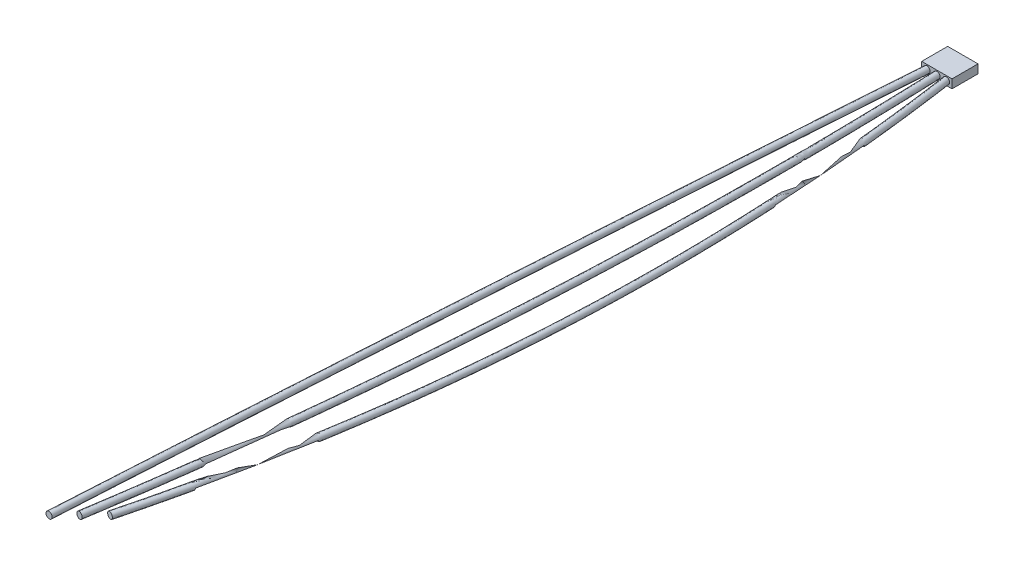
ISO-10303-21;
HEADER;
FILE_DESCRIPTION(('STEP AP214'),'2;1');
FILE_NAME('part.step','',(''),(''),'','','');
FILE_SCHEMA(('AUTOMOTIVE_DESIGN { 1 0 10303 214 1 1 1 1 }'));
ENDSEC;
DATA;
#1=APPLICATION_CONTEXT('core data for automotive mechanical design processes');
#2=APPLICATION_PROTOCOL_DEFINITION('international standard','automotive_design',2000,#1);
#3=PRODUCT_CONTEXT('',#1,'mechanical');
#4=PRODUCT('Part','Part','',(#3));
#5=PRODUCT_RELATED_PRODUCT_CATEGORY('part','',(#4));
#6=PRODUCT_DEFINITION_FORMATION('','',#4);
#7=PRODUCT_DEFINITION_CONTEXT('part definition',#1,'design');
#8=PRODUCT_DEFINITION('design','',#6,#7);
#9=PRODUCT_DEFINITION_SHAPE('','',#8);
#10=(LENGTH_UNIT() NAMED_UNIT(*) SI_UNIT(.MILLI.,.METRE.));
#11=(NAMED_UNIT(*) PLANE_ANGLE_UNIT() SI_UNIT($,.RADIAN.));
#12=(NAMED_UNIT(*) SI_UNIT($,.STERADIAN.) SOLID_ANGLE_UNIT());
#13=UNCERTAINTY_MEASURE_WITH_UNIT(LENGTH_MEASURE(1.E-05),#10,'distance_accuracy_value','');
#14=(GEOMETRIC_REPRESENTATION_CONTEXT(3) GLOBAL_UNCERTAINTY_ASSIGNED_CONTEXT((#13)) GLOBAL_UNIT_ASSIGNED_CONTEXT((#10,
#11,#12)) REPRESENTATION_CONTEXT('',''));
#15=CARTESIAN_POINT('',(0.,0.,0.));
#16=DIRECTION('',(0.,0.,1.));
#17=DIRECTION('',(1.,0.,0.));
#18=AXIS2_PLACEMENT_3D('',#15,#16,#17);
#19=CARTESIAN_POINT('',(0.,0.,6.));
#20=DIRECTION('',(0.,0.,1.));
#21=DIRECTION('',(1.,0.,0.));
#22=AXIS2_PLACEMENT_3D('',#19,#20,#21);
#23=PLANE('',#22);
#24=DIRECTION('',(0.,-1.,0.));
#25=VECTOR('',#24,1.);
#26=CARTESIAN_POINT('',(-3.49999990389549,-0.75,6.));
#27=LINE('',#26,#25);
#28=CARTESIAN_POINT('',(-3.49999990389549,-0.75,6.));
#29=VERTEX_POINT('',#28);
#30=CARTESIAN_POINT('',(-3.49999990389549,-2.75,6.));
#31=VERTEX_POINT('',#30);
#32=EDGE_CURVE('E136',#29,#31,#27,.T.);
#33=ORIENTED_EDGE('',*,*,#32,.T.);
#34=DIRECTION('',(1.,0.,0.));
#35=VECTOR('',#34,1.);
#36=CARTESIAN_POINT('',(-3.49999990389549,-2.75,6.));
#37=LINE('',#36,#35);
#38=CARTESIAN_POINT('',(3.50000009610451,-2.75,6.));
#39=VERTEX_POINT('',#38);
#40=EDGE_CURVE('E139',#31,#39,#37,.T.);
#41=ORIENTED_EDGE('',*,*,#40,.T.);
#42=DIRECTION('',(0.,1.,0.));
#43=VECTOR('',#42,1.);
#44=CARTESIAN_POINT('',(3.50000009610451,-0.75,6.));
#45=LINE('',#44,#43);
#46=CARTESIAN_POINT('',(3.50000009610451,-0.75,6.));
#47=VERTEX_POINT('',#46);
#48=EDGE_CURVE('E142',#39,#47,#45,.T.);
#49=ORIENTED_EDGE('',*,*,#48,.T.);
#50=DIRECTION('',(-1.,0.,0.));
#51=VECTOR('',#50,1.);
#52=CARTESIAN_POINT('',(-3.49999990389549,-0.75,6.));
#53=LINE('',#52,#51);
#54=EDGE_CURVE('E144',#47,#29,#53,.T.);
#55=ORIENTED_EDGE('',*,*,#54,.T.);
#56=EDGE_LOOP('',(#33,#41,#49,#55));
#57=FACE_BOUND('',#56,.T.);
#58=CARTESIAN_POINT('',(0.,-2.5,6.));
#59=CARTESIAN_POINT('',(0.0422420601804986,-2.50003573231938,6.));
#60=CARTESIAN_POINT('',(0.0844735845902979,-2.49643819312175,6.));
#61=CARTESIAN_POINT('',(0.167713085295432,-2.48223968151856,6.));
#62=CARTESIAN_POINT('',(0.208721911314351,-2.47164369717844,6.));
#63=CARTESIAN_POINT('',(0.288395779722045,-2.44370414170498,6.));
#64=CARTESIAN_POINT('',(0.327059709431002,-2.42635739576961,6.));
#65=CARTESIAN_POINT('',(0.400918183425985,-2.38542290999455,6.));
#66=CARTESIAN_POINT('',(0.436113425811239,-2.361836429483,6.00000000000001));
#67=CARTESIAN_POINT('',(0.502035117057498,-2.30909136822062,6.00000000000001));
#68=CARTESIAN_POINT('',(0.532762471171453,-2.27993391899949,6.));
#69=CARTESIAN_POINT('',(0.588882107704938,-2.21687142325243,6.));
#70=CARTESIAN_POINT('',(0.614274409453697,-2.18296639392802,6.));
#71=CARTESIAN_POINT('',(0.658986404039286,-2.11139308858211,6.));
#72=CARTESIAN_POINT('',(0.678309794516569,-2.07372712251885,6.));
#73=CARTESIAN_POINT('',(0.710353107609216,-1.99568675330466,6.));
#74=CARTESIAN_POINT('',(0.723073476653442,-1.95531253346665,6.));
#75=CARTESIAN_POINT('',(0.741544363254771,-1.87302476356265,6.));
#76=CARTESIAN_POINT('',(0.747298927163904,-1.83111212174134,6.));
#77=CARTESIAN_POINT('',(0.751687651378401,-1.74691476017158,6.));
#78=CARTESIAN_POINT('',(0.750321664135935,-1.70463003273112,6.));
#79=CARTESIAN_POINT('',(0.740509421584652,-1.62090347538399,6.));
#80=CARTESIAN_POINT('',(0.732065341839116,-1.57946139048631,6.));
#81=CARTESIAN_POINT('',(0.708340428243023,-1.49858291812733,6.));
#82=CARTESIAN_POINT('',(0.693059615168112,-1.4591465245715,6.00000000000001));
#83=CARTESIAN_POINT('',(0.656093372136737,-1.38339146463575,6.00000000000001));
#84=CARTESIAN_POINT('',(0.634406898245148,-1.34707330768323,6.));
#85=CARTESIAN_POINT('',(0.585248329269776,-1.27859270916465,6.));
#86=CARTESIAN_POINT('',(0.557776505806675,-1.24643007261232,6.));
#87=CARTESIAN_POINT('',(0.497811215194439,-1.18715215073829,6.));
#88=CARTESIAN_POINT('',(0.465314976285424,-1.16003966968815,6.));
#89=CARTESIAN_POINT('',(0.396233527832097,-1.11165186102217,6.));
#90=CARTESIAN_POINT('',(0.359648450547081,-1.09037634467827,6.));
#91=CARTESIAN_POINT('',(0.283381089860178,-1.05423650426094,6.));
#92=CARTESIAN_POINT('',(0.243694403567953,-1.03938149704547,6.));
#93=CARTESIAN_POINT('',(0.162422040673163,-1.01656401361868,6.));
#94=CARTESIAN_POINT('',(0.120839357292364,-1.00859104401534,6.00000000000001));
#95=CARTESIAN_POINT('',(0.0658171161551187,-1.00277252030283,6.));
#96=CARTESIAN_POINT('',(0.052663610310251,-1.00173227354144,6.));
#97=CARTESIAN_POINT('',(0.0263418432492268,-1.00034696208741,6.));
#98=CARTESIAN_POINT('',(0.0131736424474071,-1.00000075011629,6.));
#99=CARTESIAN_POINT('',(0.,-1.,6.));
#100=B_SPLINE_CURVE_WITH_KNOTS('',3,(#58,#59,#60,#61,#62,#63,#64,#65,#66,#67,#68,#69,#70,#71,
#72,#73,#74,#75,#76,#77,#78,#79,#80,#81,#82,#83,#84,#85,#86,#87,#88,#89,#90,#91,#92,#93,#94,#95,
#96,#97,#98,#99),.UNSPECIFIED.,.F.,.F.,(4,2,2,2,2,2,2,2,2,2,2,2,2,2,2,2,2,2,2,2,4),(0.,
0.126558204954541,0.25302630412821,0.379553951743367,0.506056082499932,0.632532546437775,
0.759008552135549,0.885407348906778,1.01179759876903,1.13811439477584,1.26443380825464,
1.39071440970181,1.51699462740679,1.64329543645469,1.76959031703342,1.89595511945057,
2.02231583560069,2.14885930426383,2.27520948311167,2.31478044763634,2.35428594501542),.UNSPECIFIED.);
#101=CARTESIAN_POINT('',(0.,-2.5,6.));
#102=VERTEX_POINT('',#101);
#103=CARTESIAN_POINT('',(0.,-1.,6.));
#104=VERTEX_POINT('',#103);
#105=EDGE_CURVE('E165',#102,#104,#100,.T.);
#106=ORIENTED_EDGE('',*,*,#105,.F.);
#107=DIRECTION('',(0.,1.,0.));
#108=VECTOR('',#107,1.);
#109=CARTESIAN_POINT('',(0.,0.,6.));
#110=LINE('',#109,#108);
#111=EDGE_CURVE('E174',#102,#104,#110,.T.);
#112=ORIENTED_EDGE('',*,*,#111,.T.);
#113=EDGE_LOOP('',(#106,#112));
#114=FACE_BOUND('',#113,.T.);
#115=CARTESIAN_POINT('',(2.17417376083445,-2.5,6.));
#116=CARTESIAN_POINT('',(2.21713490902764,-2.50003431925503,6.));
#117=CARTESIAN_POINT('',(2.26008794005801,-2.49638687339581,6.));
#118=CARTESIAN_POINT('',(2.34476610894461,-2.4819780171391,6.));
#119=CARTESIAN_POINT('',(2.38649176191179,-2.4712196368974,6.));
#120=CARTESIAN_POINT('',(2.46756507833167,-2.44283005281948,6.));
#121=CARTESIAN_POINT('',(2.50691138231187,-2.42519496194946,6.));
#122=CARTESIAN_POINT('',(2.58205588601424,-2.38354527119061,6.));
#123=CARTESIAN_POINT('',(2.61785507329974,-2.35953245383499,6.));
#124=CARTESIAN_POINT('',(2.68471004392121,-2.30590890891696,6.));
#125=CARTESIAN_POINT('',(2.71578705763082,-2.27632466172068,6.));
#126=CARTESIAN_POINT('',(2.77247130215467,-2.21231360282755,6.));
#127=CARTESIAN_POINT('',(2.79807900099597,-2.17788720590769,6.));
#128=CARTESIAN_POINT('',(2.84282879919011,-2.10553111631628,6.));
#129=CARTESIAN_POINT('',(2.86203215641496,-2.0676393106978,6.));
#130=CARTESIAN_POINT('',(2.89373564437665,-1.98915103156134,6.));
#131=CARTESIAN_POINT('',(2.90623658556077,-1.94855488571631,6.00000000000001));
#132=CARTESIAN_POINT('',(2.92407226369966,-1.86620871837886,6.00000000000001));
#133=CARTESIAN_POINT('',(2.92947170866568,-1.82447270395802,6.));
#134=CARTESIAN_POINT('',(2.93315269976957,-1.74068761570146,6.));
#135=CARTESIAN_POINT('',(2.93143432571083,-1.69863854538092,6.));
#136=CARTESIAN_POINT('',(2.92095547633365,-1.61561773441019,6.));
#137=CARTESIAN_POINT('',(2.91222620682101,-1.57464204883812,6.));
#138=CARTESIAN_POINT('',(2.88802716110072,-1.49473301846772,6.));
#139=CARTESIAN_POINT('',(2.87255738432877,-1.45579967384037,6.));
#140=CARTESIAN_POINT('',(2.83529406981959,-1.38097773232351,6.));
#141=CARTESIAN_POINT('',(2.81348623131095,-1.34509626079295,6.));
#142=CARTESIAN_POINT('',(2.76420143983094,-1.27746839439417,6.));
#143=CARTESIAN_POINT('',(2.73672456853074,-1.2457219399654,6.));
#144=CARTESIAN_POINT('',(2.67665499065831,-1.18698925679447,5.99999999999999));
#145=CARTESIAN_POINT('',(2.64402352671185,-1.16004267932414,6.));
#146=CARTESIAN_POINT('',(2.57473617772891,-1.11194511208712,6.));
#147=CARTESIAN_POINT('',(2.53808010365247,-1.09079439472104,6.00000000000001));
#148=CARTESIAN_POINT('',(2.46136705709958,-1.0546510523637,5.99999999999999));
#149=CARTESIAN_POINT('',(2.4212774131093,-1.03972795369816,5.99999999999997));
#150=CARTESIAN_POINT('',(2.33920390982144,-1.01678605506887,6.00000000000003));
#151=CARTESIAN_POINT('',(2.29722289992802,-1.00875721211502,6.00000000000011));
#152=CARTESIAN_POINT('',(2.24149987982337,-1.00284522122101,6.00000000000005));
#153=CARTESIAN_POINT('',(2.22804479481852,-1.00177766256124,6.00000000000002));
#154=CARTESIAN_POINT('',(2.20111952004914,-1.00035601829081,5.99999999999998));
#155=CARTESIAN_POINT('',(2.18764939313658,-1.00000074295051,5.99999999999998));
#156=CARTESIAN_POINT('',(2.17417376083445,-1.,6.));
#157=B_SPLINE_CURVE_WITH_KNOTS('',3,(#115,#116,#117,#118,#119,#120,#121,#122,#123,#124,#125,
#126,#127,#128,#129,#130,#131,#132,#133,#134,#135,#136,#137,#138,#139,#140,#141,#142,#143,#144,
#145,#146,#147,#148,#149,#150,#151,#152,#153,#154,#155,#156),.UNSPECIFIED.,.F.,.F.,(4,2,2,2,2,2,
2,2,2,2,2,2,2,2,2,2,2,2,2,2,4),(0.,0.128717773954852,0.257380733218632,0.386116524384565,
0.514816372526064,0.642919294900131,0.771011250694663,0.897840292197619,1.02465399424013,
1.15030398999321,1.27595257699052,1.40104497562293,1.5261373847276,1.65151426465997,
1.77688933847106,1.90325640479263,2.02962940924329,2.15737778307555,2.28493974624479,
2.32541861806767,2.36582982135317),.UNSPECIFIED.);
#158=CARTESIAN_POINT('',(2.17417376083445,-2.5,6.));
#159=VERTEX_POINT('',#158);
#160=CARTESIAN_POINT('',(2.17417376083445,-1.,6.));
#161=VERTEX_POINT('',#160);
#162=EDGE_CURVE('E75',#159,#161,#157,.T.);
#163=ORIENTED_EDGE('',*,*,#162,.F.);
#164=DIRECTION('',(0.,1.,0.));
#165=VECTOR('',#164,1.);
#166=CARTESIAN_POINT('',(2.17417376083445,0.,6.));
#167=LINE('',#166,#165);
#168=EDGE_CURVE('E116',#159,#161,#167,.T.);
#169=ORIENTED_EDGE('',*,*,#168,.T.);
#170=EDGE_LOOP('',(#163,#169));
#171=FACE_BOUND('',#170,.T.);
#172=CARTESIAN_POINT('',(-2.24999990389548,-1.,6.));
#173=CARTESIAN_POINT('',(-2.29237554964298,-0.999964528874485,6.));
#174=CARTESIAN_POINT('',(-2.33474110236717,-1.00357132327649,6.));
#175=CARTESIAN_POINT('',(-2.4182478346468,-1.01780880939609,6.));
#176=CARTESIAN_POINT('',(-2.45938980266773,-1.02843487078616,6.));
#177=CARTESIAN_POINT('',(-2.53932364739332,-1.05645773033628,6.));
#178=CARTESIAN_POINT('',(-2.57811436632003,-1.07385783329737,6.));
#179=CARTESIAN_POINT('',(-2.65221194522455,-1.11492460610649,6.));
#180=CARTESIAN_POINT('',(-2.6875195558876,-1.13858992159769,6.));
#181=CARTESIAN_POINT('',(-2.75361602366836,-1.19149792324521,6.));
#182=CARTESIAN_POINT('',(-2.78440942856667,-1.22073492699964,6.));
#183=CARTESIAN_POINT('',(-2.84063622139642,-1.28397428549526,6.));
#184=CARTESIAN_POINT('',(-2.86606970936761,-1.31797655127586,6.));
#185=CARTESIAN_POINT('',(-2.91079114821437,-1.38969656277801,6.));
#186=CARTESIAN_POINT('',(-2.9300933404366,-1.42740542805931,6.));
#187=CARTESIAN_POINT('',(-2.9620755095211,-1.50553114363755,6.));
#188=CARTESIAN_POINT('',(-2.97475599934324,-1.54594778389898,6.00000000000001));
#189=CARTESIAN_POINT('',(-2.99310973951703,-1.62824830434696,6.00000000000001));
#190=CARTESIAN_POINT('',(-2.99879835984311,-1.67012875733947,6.));
#191=CARTESIAN_POINT('',(-3.00305531410795,-1.75425080380142,6.));
#192=CARTESIAN_POINT('',(-3.00162354406536,-1.79649240253578,6.));
#193=CARTESIAN_POINT('',(-2.9916863375309,-1.88008760871098,6.));
#194=CARTESIAN_POINT('',(-2.98318870652376,-1.92144214438191,6.));
#195=CARTESIAN_POINT('',(-2.95937464358089,-2.00213856580253,6.));
#196=CARTESIAN_POINT('',(-2.94405822950235,-2.04148045682269,6.));
#197=CARTESIAN_POINT('',(-2.90703633681857,-2.11705949457104,6.));
#198=CARTESIAN_POINT('',(-2.88532741808089,-2.15329495597961,6.));
#199=CARTESIAN_POINT('',(-2.83614605754847,-2.22161411599292,6.));
#200=CARTESIAN_POINT('',(-2.80867385057155,-2.25369798366297,6.));
#201=CARTESIAN_POINT('',(-2.74869046565918,-2.31287282628465,6.));
#202=CARTESIAN_POINT('',(-2.716169657465,-2.33995403779316,6.));
#203=CARTESIAN_POINT('',(-2.6470513117326,-2.38828736015262,6.));
#204=CARTESIAN_POINT('',(-2.61045384398774,-2.40953957077586,6.00000000000001));
#205=CARTESIAN_POINT('',(-2.53410459047819,-2.44568092284157,6.));
#206=CARTESIAN_POINT('',(-2.49434301459231,-2.46054932662149,5.99999999999999));
#207=CARTESIAN_POINT('',(-2.41292165776332,-2.48339150107317,6.00000000000001));
#208=CARTESIAN_POINT('',(-2.37126484255684,-2.49137567855695,6.00000000000004));
#209=CARTESIAN_POINT('',(-2.31610975286248,-2.49721294266361,6.00000000000002));
#210=CARTESIAN_POINT('',(-2.30289775088739,-2.49825864979989,6.00000000000001));
#211=CARTESIAN_POINT('',(-2.27645891168879,-2.49965122624236,5.99999999999999));
#212=CARTESIAN_POINT('',(-2.26323213536837,-2.49999925119205,5.99999999999999));
#213=CARTESIAN_POINT('',(-2.24999990389548,-2.5,6.));
#214=B_SPLINE_CURVE_WITH_KNOTS('',3,(#172,#173,#174,#175,#176,#177,#178,#179,#180,#181,#182,
#183,#184,#185,#186,#187,#188,#189,#190,#191,#192,#193,#194,#195,#196,#197,#198,#199,#200,#201,
#202,#203,#204,#205,#206,#207,#208,#209,#210,#211,#212,#213),.UNSPECIFIED.,.F.,.F.,(4,2,2,2,2,2,
2,2,2,2,2,2,2,2,2,2,2,2,2,2,4),(0.,0.126959381181298,0.253835095898848,0.380772786247419,
0.507683058731716,0.634464585194193,0.761243745143085,0.887726240732957,1.01419893671703,
1.14039311220021,1.26658913054292,1.39264592812993,1.51870239559827,1.64482682483851,
1.77094611629744,1.89730900657122,2.02366973381527,2.15043789136142,2.27701407715135,
2.3167611786438,2.35644238830301),.UNSPECIFIED.);
#215=CARTESIAN_POINT('',(-2.24999990389548,-1.,6.));
#216=VERTEX_POINT('',#215);
#217=CARTESIAN_POINT('',(-2.24999990389548,-2.5,6.));
#218=VERTEX_POINT('',#217);
#219=EDGE_CURVE('E64',#216,#218,#214,.T.);
#220=ORIENTED_EDGE('',*,*,#219,.F.);
#221=DIRECTION('',(0.,-1.,0.));
#222=VECTOR('',#221,1.);
#223=CARTESIAN_POINT('',(-2.24999990389548,0.,6.));
#224=LINE('',#223,#222);
#225=EDGE_CURVE('E12',#216,#218,#224,.T.);
#226=ORIENTED_EDGE('',*,*,#225,.T.);
#227=EDGE_LOOP('',(#220,#226));
#228=FACE_BOUND('',#227,.T.);
#229=ADVANCED_FACE('F56',(#57,#114,#171,#228),#23,.T.);
#230=CARTESIAN_POINT('',(-3.49999990389549,-0.75,6.));
#231=DIRECTION('',(1.,0.,0.));
#232=DIRECTION('',(0.,0.,-1.));
#233=AXIS2_PLACEMENT_3D('',#230,#231,#232);
#234=PLANE('',#233);
#235=DIRECTION('',(0.,-1.,0.));
#236=VECTOR('',#235,1.);
#237=CARTESIAN_POINT('',(-3.49999990389549,-0.75,0.));
#238=LINE('',#237,#236);
#239=CARTESIAN_POINT('',(-3.49999990389549,-0.75,0.));
#240=VERTEX_POINT('',#239);
#241=CARTESIAN_POINT('',(-3.49999990389549,-2.75,0.));
#242=VERTEX_POINT('',#241);
#243=EDGE_CURVE('E135',#240,#242,#238,.T.);
#244=ORIENTED_EDGE('',*,*,#243,.T.);
#245=DIRECTION('',(0.,0.,-1.));
#246=VECTOR('',#245,1.);
#247=CARTESIAN_POINT('',(-3.49999990389549,-2.75,6.));
#248=LINE('',#247,#246);
#249=EDGE_CURVE('E162',#31,#242,#248,.T.);
#250=ORIENTED_EDGE('',*,*,#249,.F.);
#251=ORIENTED_EDGE('',*,*,#32,.F.);
#252=DIRECTION('',(0.,0.,-1.));
#253=VECTOR('',#252,1.);
#254=CARTESIAN_POINT('',(-3.49999990389549,-0.75,6.));
#255=LINE('',#254,#253);
#256=EDGE_CURVE('E146',#29,#240,#255,.T.);
#257=ORIENTED_EDGE('',*,*,#256,.T.);
#258=EDGE_LOOP('',(#244,#250,#251,#257));
#259=FACE_BOUND('',#258,.T.);
#260=ADVANCED_FACE('F58',(#259),#234,.F.);
#261=CARTESIAN_POINT('',(-3.49999990389549,-2.75,6.));
#262=DIRECTION('',(0.,1.,0.));
#263=DIRECTION('',(0.,0.,1.));
#264=AXIS2_PLACEMENT_3D('',#261,#262,#263);
#265=PLANE('',#264);
#266=DIRECTION('',(1.,0.,0.));
#267=VECTOR('',#266,1.);
#268=CARTESIAN_POINT('',(-3.49999990389549,-2.75,0.));
#269=LINE('',#268,#267);
#270=CARTESIAN_POINT('',(3.50000009610451,-2.75,0.));
#271=VERTEX_POINT('',#270);
#272=EDGE_CURVE('E149',#242,#271,#269,.T.);
#273=ORIENTED_EDGE('',*,*,#272,.T.);
#274=DIRECTION('',(0.,0.,-1.));
#275=VECTOR('',#274,1.);
#276=CARTESIAN_POINT('',(3.50000009610451,-2.75,6.));
#277=LINE('',#276,#275);
#278=EDGE_CURVE('E159',#39,#271,#277,.T.);
#279=ORIENTED_EDGE('',*,*,#278,.F.);
#280=ORIENTED_EDGE('',*,*,#40,.F.);
#281=ORIENTED_EDGE('',*,*,#249,.T.);
#282=EDGE_LOOP('',(#273,#279,#280,#281));
#283=FACE_BOUND('',#282,.T.);
#284=ADVANCED_FACE('F217',(#283),#265,.F.);
#285=CARTESIAN_POINT('',(3.50000009610451,-0.75,6.));
#286=DIRECTION('',(-1.,0.,0.));
#287=DIRECTION('',(0.,0.,1.));
#288=AXIS2_PLACEMENT_3D('',#285,#286,#287);
#289=PLANE('',#288);
#290=DIRECTION('',(0.,1.,0.));
#291=VECTOR('',#290,1.);
#292=CARTESIAN_POINT('',(3.50000009610451,-0.75,0.));
#293=LINE('',#292,#291);
#294=CARTESIAN_POINT('',(3.50000009610451,-0.75,0.));
#295=VERTEX_POINT('',#294);
#296=EDGE_CURVE('E151',#271,#295,#293,.T.);
#297=ORIENTED_EDGE('',*,*,#296,.T.);
#298=DIRECTION('',(0.,0.,-1.));
#299=VECTOR('',#298,1.);
#300=CARTESIAN_POINT('',(3.50000009610451,-0.75,6.));
#301=LINE('',#300,#299);
#302=EDGE_CURVE('E156',#47,#295,#301,.T.);
#303=ORIENTED_EDGE('',*,*,#302,.F.);
#304=ORIENTED_EDGE('',*,*,#48,.F.);
#305=ORIENTED_EDGE('',*,*,#278,.T.);
#306=EDGE_LOOP('',(#297,#303,#304,#305));
#307=FACE_BOUND('',#306,.T.);
#308=ADVANCED_FACE('F347',(#307),#289,.F.);
#309=CARTESIAN_POINT('',(-3.49999990389549,-0.75,6.));
#310=DIRECTION('',(0.,-1.,0.));
#311=DIRECTION('',(0.,0.,-1.));
#312=AXIS2_PLACEMENT_3D('',#309,#310,#311);
#313=PLANE('',#312);
#314=DIRECTION('',(-1.,0.,0.));
#315=VECTOR('',#314,1.);
#316=CARTESIAN_POINT('',(-3.49999990389549,-0.75,0.));
#317=LINE('',#316,#315);
#318=EDGE_CURVE('E140',#295,#240,#317,.T.);
#319=ORIENTED_EDGE('',*,*,#318,.T.);
#320=ORIENTED_EDGE('',*,*,#256,.F.);
#321=ORIENTED_EDGE('',*,*,#54,.F.);
#322=ORIENTED_EDGE('',*,*,#302,.T.);
#323=EDGE_LOOP('',(#319,#320,#321,#322));
#324=FACE_BOUND('',#323,.T.);
#325=ADVANCED_FACE('F205',(#324),#313,.F.);
#326=CARTESIAN_POINT('',(0.,0.,0.));
#327=DIRECTION('',(0.,0.,1.));
#328=DIRECTION('',(1.,0.,0.));
#329=AXIS2_PLACEMENT_3D('',#326,#327,#328);
#330=PLANE('',#329);
#331=ORIENTED_EDGE('',*,*,#243,.F.);
#332=ORIENTED_EDGE('',*,*,#318,.F.);
#333=ORIENTED_EDGE('',*,*,#296,.F.);
#334=ORIENTED_EDGE('',*,*,#272,.F.);
#335=EDGE_LOOP('',(#331,#332,#333,#334));
#336=FACE_BOUND('',#335,.T.);
#337=ADVANCED_FACE('F189',(#336),#330,.F.);
#338=CARTESIAN_POINT('',(0.,-1.75,6.));
#339=DIRECTION('',(0.0368502974406227,0.,0.999320797131));
#340=DIRECTION('',(0.999320797131,0.,-0.0368502974406227));
#341=AXIS2_PLACEMENT_3D('',#338,#339,#340);
#342=PLANE('',#341);
#343=ORIENTED_EDGE('',*,*,#111,.F.);
#344=CARTESIAN_POINT('',(0.,-1.75,6.));
#345=DIRECTION('',(0.0368502974406227,0.,0.999320797131));
#346=DIRECTION('',(0.999320797131,0.,-0.0368502974406227));
#347=AXIS2_PLACEMENT_3D('',#344,#345,#346);
#348=CIRCLE('',#347,0.75);
#349=EDGE_CURVE('E129',#104,#102,#348,.T.);
#350=ORIENTED_EDGE('',*,*,#349,.F.);
#351=EDGE_LOOP('',(#343,#350));
#352=FACE_BOUND('',#351,.T.);
#353=ADVANCED_FACE('F197',(#352),#342,.F.);
#354=CARTESIAN_POINT('',(-10.9670185904693,-1.75,193.0200635925));
#355=DIRECTION('',(-0.153853755498874,0.,0.988093630137799));
#356=DIRECTION('',(0.988093630137799,0.,0.153853755498874));
#357=AXIS2_PLACEMENT_3D('',#354,#355,#356);
#358=PLANE('',#357);
#359=CARTESIAN_POINT('',(-10.9670185904693,-1.75,193.0200635925));
#360=DIRECTION('',(-0.153853755498874,0.,0.988093630137799));
#361=DIRECTION('',(0.988093630137799,0.,0.153853755498874));
#362=AXIS2_PLACEMENT_3D('',#359,#360,#361);
#363=CIRCLE('',#362,0.75);
#364=CARTESIAN_POINT('',(-10.2259483678659,-1.75,193.135453909125));
#365=VERTEX_POINT('',#364);
#366=EDGE_CURVE('E132',#365,#365,#363,.T.);
#367=ORIENTED_EDGE('',*,*,#366,.T.);
#368=EDGE_LOOP('',(#367));
#369=FACE_BOUND('',#368,.T.);
#370=ADVANCED_FACE('F187',(#369),#358,.T.);
#371=CARTESIAN_POINT('',(0.74949059784825,-1.75,5.97236227691953));
#372=CARTESIAN_POINT('',(3.06855273914605,-1.75000000008182,68.8615976046287));
#373=CARTESIAN_POINT('',(-0.589934504093075,-1.75,131.250166234467));
#374=CARTESIAN_POINT('',(-10.2259483678659,-1.75,193.135453909125));
#375=CARTESIAN_POINT('',(0.74949059784825,-0.25,5.97236227691953));
#376=CARTESIAN_POINT('',(3.06855273914605,-0.250000000068179,68.8615976046287));
#377=CARTESIAN_POINT('',(-0.589934504093075,-0.25,131.250166234467));
#378=CARTESIAN_POINT('',(-10.2259483678659,-0.25,193.135453909125));
#379=CARTESIAN_POINT('',(-0.74949059784825,-0.25,6.02763772308047));
#380=CARTESIAN_POINT('',(1.56608459769649,-0.250000000068179,68.8223126910618));
#381=CARTESIAN_POINT('',(-2.08677388618987,-0.25,131.113786455155));
#382=CARTESIAN_POINT('',(-11.7080888130726,-0.25,192.904673275876));
#383=CARTESIAN_POINT('',(-0.74949059784825,-1.75,6.02763772308047));
#384=CARTESIAN_POINT('',(1.56608459769649,-1.75000000008182,68.8223126910618));
#385=CARTESIAN_POINT('',(-2.08677388610845,-1.75,131.113786455155));
#386=CARTESIAN_POINT('',(-11.7080888130726,-1.75,192.904673275876));
#387=CARTESIAN_POINT('',(-0.74949059784825,-3.25,6.02763772308047));
#388=CARTESIAN_POINT('',(1.56608459769649,-3.25000000009545,68.8223126910618));
#389=CARTESIAN_POINT('',(-2.08677388602703,-3.25,131.113786455155));
#390=CARTESIAN_POINT('',(-11.7080888130726,-3.25,192.904673275876));
#391=CARTESIAN_POINT('',(0.74949059784825,-3.25,5.97236227691953));
#392=CARTESIAN_POINT('',(3.06855273914605,-3.25000000009545,68.8615976046287));
#393=CARTESIAN_POINT('',(-0.589934504093075,-3.25,131.250166234467));
#394=CARTESIAN_POINT('',(-10.2259483678659,-3.25,193.135453909125));
#395=CARTESIAN_POINT('',(0.74949059784825,-1.75,5.97236227691953));
#396=CARTESIAN_POINT('',(3.06855273914605,-1.75000000008182,68.8615976046287));
#397=CARTESIAN_POINT('',(-0.589934504093075,-1.75,131.250166234467));
#398=CARTESIAN_POINT('',(-10.2259483678659,-1.75,193.135453909125));
#399=(BOUNDED_SURFACE() B_SPLINE_SURFACE(3,3,((#371,#372,#373,#374),(#375,#376,#377,#378),(#379,
#380,#381,#382),(#383,#384,#385,#386),(#387,#388,#389,#390),(#391,#392,#393,#394),(#395,#396,
#397,#398)),.UNSPECIFIED.,.T.,.F.,.F.) B_SPLINE_SURFACE_WITH_KNOTS((4,3,4),(4,4),(0.,0.5,1.),
(0.,1.),.UNSPECIFIED.) GEOMETRIC_REPRESENTATION_ITEM() RATIONAL_B_SPLINE_SURFACE(((1.,1.,1.,1.),
(0.333333333333333,0.333333333333333,0.333333333333333,0.333333333333333),(0.333333333333333,
0.333333333333333,0.333333333333333,0.333333333333333),(1.,1.,1.,1.),(0.333333333333333,
0.333333333333333,0.333333333333333,0.333333333333333),(0.333333333333333,0.333333333333333,
0.333333333333333,0.333333333333333),(1.,1.,1.,1.))) REPRESENTATION_ITEM('') SURFACE());
#400=ORIENTED_EDGE('',*,*,#366,.F.);
#401=EDGE_LOOP('',(#400));
#402=FACE_BOUND('',#401,.T.);
#403=ORIENTED_EDGE('',*,*,#349,.T.);
#404=ORIENTED_EDGE('',*,*,#105,.T.);
#405=EDGE_LOOP('',(#403,#404));
#406=FACE_BOUND('',#405,.T.);
#407=ADVANCED_FACE('F179',(#402,#406),#399,.T.);
#408=CARTESIAN_POINT('',(2.17417376083446,-1.75,6.));
#409=DIRECTION('',(0.143701163051908,0.,0.989621127370232));
#410=DIRECTION('',(0.989621127370232,0.,-0.143701163051908));
#411=AXIS2_PLACEMENT_3D('',#408,#409,#410);
#412=PLANE('',#411);
#413=ORIENTED_EDGE('',*,*,#168,.F.);
#414=CARTESIAN_POINT('',(2.17417376083446,-1.75,6.));
#415=DIRECTION('',(0.143701163051908,0.,0.989621127370232));
#416=DIRECTION('',(0.989621127370232,0.,-0.143701163051908));
#417=AXIS2_PLACEMENT_3D('',#414,#415,#416);
#418=CIRCLE('',#417,0.75);
#419=EDGE_CURVE('E121',#161,#159,#418,.T.);
#420=ORIENTED_EDGE('',*,*,#419,.F.);
#421=EDGE_LOOP('',(#413,#420));
#422=FACE_BOUND('',#421,.T.);
#423=ADVANCED_FACE('F186',(#422),#412,.F.);
#424=CARTESIAN_POINT('',(-7.44709743994727,-1.75,189.500147609436));
#425=DIRECTION('',(-0.250607102598843,0.,0.968088880282701));
#426=DIRECTION('',(0.968088880282701,0.,0.250607102598843));
#427=AXIS2_PLACEMENT_3D('',#424,#425,#426);
#428=PLANE('',#427);
#429=CARTESIAN_POINT('',(-7.44709743994727,-1.75,189.500147609436));
#430=DIRECTION('',(-0.250607102598843,0.,0.968088880282701));
#431=DIRECTION('',(0.968088880282701,0.,0.250607102598843));
#432=AXIS2_PLACEMENT_3D('',#429,#430,#431);
#433=CIRCLE('',#432,0.75);
#434=CARTESIAN_POINT('',(-6.72103077973525,-1.75,189.688102936386));
#435=VERTEX_POINT('',#434);
#436=EDGE_CURVE('E126',#435,#435,#433,.T.);
#437=ORIENTED_EDGE('',*,*,#436,.T.);
#438=EDGE_LOOP('',(#437));
#439=FACE_BOUND('',#438,.T.);
#440=ADVANCED_FACE('F209',(#439),#428,.T.);
#441=CARTESIAN_POINT('',(2.91638960636213,-1.75,5.89222412771107));
#442=CARTESIAN_POINT('',(12.005249490067,-1.75,68.4841167305947));
#443=CARTESIAN_POINT('',(8.79318089517851,-1.75,129.757096780206));
#444=CARTESIAN_POINT('',(-6.72103077973524,-1.75,189.688102936386));
#445=CARTESIAN_POINT('',(2.91638960636213,-0.25,5.89222412771107));
#446=CARTESIAN_POINT('',(12.005249490067,-0.25,68.4841167305947));
#447=CARTESIAN_POINT('',(8.79318089517852,-0.25,129.757096780206));
#448=CARTESIAN_POINT('',(-6.72103077973524,-0.25,189.688102936386));
#449=CARTESIAN_POINT('',(1.43195791530678,-0.25,6.10777587228893));
#450=CARTESIAN_POINT('',(10.4935957091831,-0.25,68.5121991837264));
#451=CARTESIAN_POINT('',(7.29148350375931,-0.25,129.572650874608));
#452=CARTESIAN_POINT('',(-8.1731641001593,-0.25,189.312192282487));
#453=CARTESIAN_POINT('',(1.43195791530678,-1.75,6.10777587228893));
#454=CARTESIAN_POINT('',(10.4935957091831,-1.75,68.5121991837264));
#455=CARTESIAN_POINT('',(7.2914835036521,-1.75,129.572650874608));
#456=CARTESIAN_POINT('',(-8.1731641001593,-1.75,189.312192282487));
#457=CARTESIAN_POINT('',(1.43195791530678,-3.25,6.10777587228893));
#458=CARTESIAN_POINT('',(10.4935957091831,-3.25,68.5121991837264));
#459=CARTESIAN_POINT('',(7.29148350354488,-3.25,129.572650874608));
#460=CARTESIAN_POINT('',(-8.1731641001593,-3.25,189.312192282487));
#461=CARTESIAN_POINT('',(2.91638960636213,-3.25,5.89222412771107));
#462=CARTESIAN_POINT('',(12.005249490067,-3.25,68.4841167305947));
#463=CARTESIAN_POINT('',(8.79318089517852,-3.25,129.757096780206));
#464=CARTESIAN_POINT('',(-6.72103077973524,-3.25,189.688102936386));
#465=CARTESIAN_POINT('',(2.91638960636213,-1.75,5.89222412771107));
#466=CARTESIAN_POINT('',(12.005249490067,-1.75,68.4841167305947));
#467=CARTESIAN_POINT('',(8.79318089517851,-1.75,129.757096780206));
#468=CARTESIAN_POINT('',(-6.72103077973524,-1.75,189.688102936386));
#469=(BOUNDED_SURFACE() B_SPLINE_SURFACE(3,3,((#441,#442,#443,#444),(#445,#446,#447,#448),(#449,
#450,#451,#452),(#453,#454,#455,#456),(#457,#458,#459,#460),(#461,#462,#463,#464),(#465,#466,
#467,#468)),.UNSPECIFIED.,.T.,.F.,.F.) B_SPLINE_SURFACE_WITH_KNOTS((4,3,4),(4,4),(0.,0.5,1.),
(0.,1.),.UNSPECIFIED.) GEOMETRIC_REPRESENTATION_ITEM() RATIONAL_B_SPLINE_SURFACE(((1.,1.,1.,1.),
(0.333333333333333,0.333333333333333,0.333333333333333,0.333333333333333),(0.333333333333333,
0.333333333333333,0.333333333333333,0.333333333333333),(1.,1.,1.,1.),(0.333333333333333,
0.333333333333333,0.333333333333333,0.333333333333333),(0.333333333333333,0.333333333333333,
0.333333333333333,0.333333333333333),(1.,1.,1.,1.))) REPRESENTATION_ITEM('') SURFACE());
#470=ORIENTED_EDGE('',*,*,#436,.F.);
#471=EDGE_LOOP('',(#470));
#472=FACE_BOUND('',#471,.T.);
#473=ORIENTED_EDGE('',*,*,#419,.T.);
#474=ORIENTED_EDGE('',*,*,#162,.T.);
#475=EDGE_LOOP('',(#473,#474));
#476=FACE_BOUND('',#475,.T.);
#477=ADVANCED_FACE('F201',(#472,#476),#469,.T.);
#478=CARTESIAN_POINT('',(-2.24999990389549,-1.75,6.));
#479=DIRECTION('',(-0.0707302319935764,0.,0.997495480832938));
#480=DIRECTION('',(0.997495480832938,0.,0.0707302319935764));
#481=AXIS2_PLACEMENT_3D('',#478,#479,#480);
#482=PLANE('',#481);
#483=ORIENTED_EDGE('',*,*,#225,.F.);
#484=CARTESIAN_POINT('',(-2.24999990389549,-1.75,6.));
#485=DIRECTION('',(-0.0707302319935764,0.,0.997495480832938));
#486=DIRECTION('',(0.997495480832938,0.,0.0707302319935764));
#487=AXIS2_PLACEMENT_3D('',#484,#485,#486);
#488=CIRCLE('',#487,0.75);
#489=EDGE_CURVE('E115',#218,#216,#488,.T.);
#490=ORIENTED_EDGE('',*,*,#489,.F.);
#491=EDGE_LOOP('',(#483,#490));
#492=FACE_BOUND('',#491,.T.);
#493=ADVANCED_FACE('F117',(#492),#482,.F.);
#494=CARTESIAN_POINT('',(-14.5107047449234,-1.75,196.51083119325));
#495=DIRECTION('',(-0.0577151589646066,0.,0.998333090919905));
#496=DIRECTION('',(0.998333090919905,0.,0.0577151589646066));
#497=AXIS2_PLACEMENT_3D('',#494,#495,#496);
#498=PLANE('',#497);
#499=CARTESIAN_POINT('',(-14.5107047449234,-1.75,196.51083119325));
#500=DIRECTION('',(-0.0577151589646066,0.,0.998333090919905));
#501=DIRECTION('',(0.998333090919905,0.,0.0577151589646066));
#502=AXIS2_PLACEMENT_3D('',#499,#500,#501);
#503=CIRCLE('',#502,0.75);
#504=CARTESIAN_POINT('',(-13.7619549267334,-1.75,196.554117562474));
#505=VERTEX_POINT('',#504);
#506=EDGE_CURVE('E118',#505,#505,#503,.T.);
#507=ORIENTED_EDGE('',*,*,#506,.T.);
#508=EDGE_LOOP('',(#507));
#509=FACE_BOUND('',#508,.T.);
#510=ADVANCED_FACE('F251',(#509),#498,.T.);
#511=CARTESIAN_POINT('',(-1.50187829327078,-1.75,6.05304767399518));
#512=CARTESIAN_POINT('',(-6.00270914581162,-1.75,69.5274391586958));
#513=CARTESIAN_POINT('',(-10.0894013384643,-1.75,133.027795517451));
#514=CARTESIAN_POINT('',(-13.7619549267334,-1.75,196.554117562474));
#515=CARTESIAN_POINT('',(-1.50187829327078,-0.25,6.05304767399518));
#516=CARTESIAN_POINT('',(-6.00270914581162,-0.25,69.5274391586958));
#517=CARTESIAN_POINT('',(-10.0894013384643,-0.25,133.027795517451));
#518=CARTESIAN_POINT('',(-13.7619549267334,-0.25,196.554117562474));
#519=CARTESIAN_POINT('',(-2.99812151452019,-0.25,5.94695232600482));
#520=CARTESIAN_POINT('',(-7.49941357910384,-0.25,69.4278481993185));
#521=CARTESIAN_POINT('',(-11.5865246141023,-0.25,132.934712645926));
#522=CARTESIAN_POINT('',(-15.2594545631133,-0.25,196.467544824027));
#523=CARTESIAN_POINT('',(-2.99812151452019,-1.75,5.94695232600482));
#524=CARTESIAN_POINT('',(-7.49941357910384,-1.75,69.4278481993185));
#525=CARTESIAN_POINT('',(-11.5865246141023,-1.75,132.934712645926));
#526=CARTESIAN_POINT('',(-15.2594545631133,-1.75,196.467544824027));
#527=CARTESIAN_POINT('',(-2.99812151452019,-3.25,5.94695232600482));
#528=CARTESIAN_POINT('',(-7.49941357910384,-3.25,69.4278481993185));
#529=CARTESIAN_POINT('',(-11.5865246141023,-3.25,132.934712645926));
#530=CARTESIAN_POINT('',(-15.2594545631133,-3.25,196.467544824027));
#531=CARTESIAN_POINT('',(-1.50187829327078,-3.25,6.05304767399518));
#532=CARTESIAN_POINT('',(-6.00270914581162,-3.25,69.5274391586958));
#533=CARTESIAN_POINT('',(-10.0894013384643,-3.25,133.027795517451));
#534=CARTESIAN_POINT('',(-13.7619549267334,-3.25,196.554117562474));
#535=CARTESIAN_POINT('',(-1.50187829327078,-1.75,6.05304767399518));
#536=CARTESIAN_POINT('',(-6.00270914581162,-1.75,69.5274391586958));
#537=CARTESIAN_POINT('',(-10.0894013384643,-1.75,133.027795517451));
#538=CARTESIAN_POINT('',(-13.7619549267334,-1.75,196.554117562474));
#539=(BOUNDED_SURFACE() B_SPLINE_SURFACE(3,3,((#511,#512,#513,#514),(#515,#516,#517,#518),(#519,
#520,#521,#522),(#523,#524,#525,#526),(#527,#528,#529,#530),(#531,#532,#533,#534),(#535,#536,
#537,#538)),.UNSPECIFIED.,.T.,.F.,.F.) B_SPLINE_SURFACE_WITH_KNOTS((4,3,4),(4,4),(0.,0.5,1.),
(0.,1.),.UNSPECIFIED.) GEOMETRIC_REPRESENTATION_ITEM() RATIONAL_B_SPLINE_SURFACE(((1.,1.,1.,1.),
(0.333333333333333,0.333333333333333,0.333333333333333,0.333333333333333),(0.333333333333333,
0.333333333333333,0.333333333333333,0.333333333333333),(1.,1.,1.,1.),(0.333333333333333,
0.333333333333333,0.333333333333333,0.333333333333333),(0.333333333333333,0.333333333333333,
0.333333333333333,0.333333333333333),(1.,1.,1.,1.))) REPRESENTATION_ITEM('') SURFACE());
#540=ORIENTED_EDGE('',*,*,#506,.F.);
#541=EDGE_LOOP('',(#540));
#542=FACE_BOUND('',#541,.T.);
#543=ORIENTED_EDGE('',*,*,#489,.T.);
#544=ORIENTED_EDGE('',*,*,#219,.T.);
#545=EDGE_LOOP('',(#543,#544));
#546=FACE_BOUND('',#545,.T.);
#547=ADVANCED_FACE('F114',(#542,#546),#539,.T.);
#548=CLOSED_SHELL('',(#229,#260,#284,#308,#325,#337,#353,#370,#407,#423,#440,#477,#493,#510,#547));
#549=MANIFOLD_SOLID_BREP('B2',#548);
#550=ADVANCED_BREP_SHAPE_REPRESENTATION('',(#18,#549),#14);
#551=SHAPE_DEFINITION_REPRESENTATION(#9,#550);
ENDSEC;
END-ISO-10303-21;
